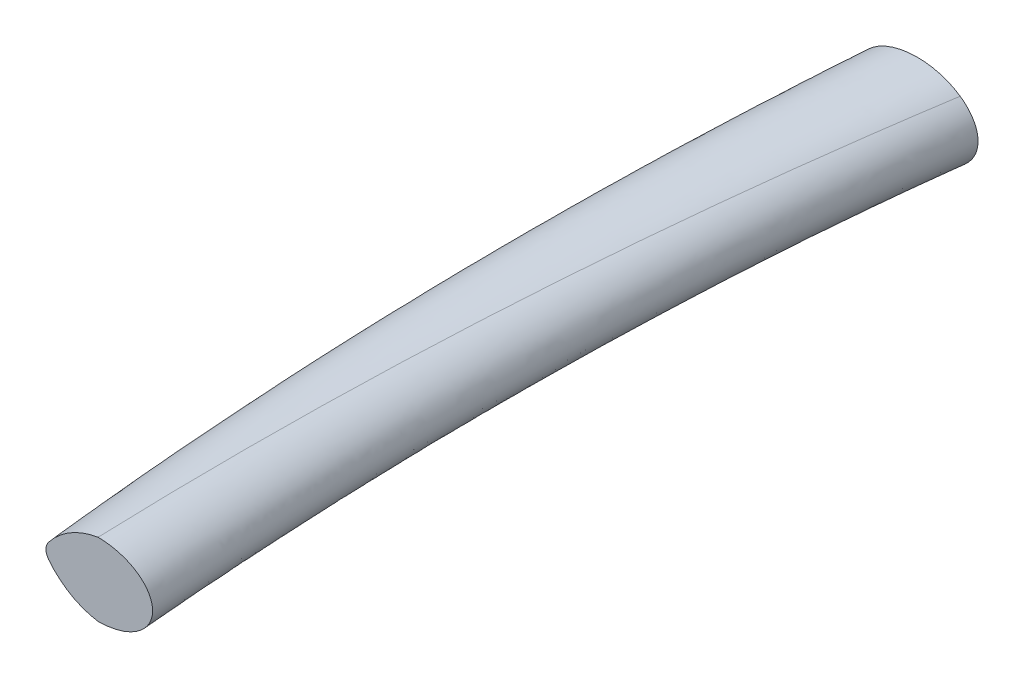
ISO-10303-21;
HEADER;
FILE_DESCRIPTION(('STEP AP214'),'2;1');
FILE_NAME('part.step','',(''),(''),'','','');
FILE_SCHEMA(('AUTOMOTIVE_DESIGN { 1 0 10303 214 1 1 1 1 }'));
ENDSEC;
DATA;
#1=APPLICATION_CONTEXT('core data for automotive mechanical design processes');
#2=APPLICATION_PROTOCOL_DEFINITION('international standard','automotive_design',2000,#1);
#3=PRODUCT_CONTEXT('',#1,'mechanical');
#4=PRODUCT('Part','Part','',(#3));
#5=PRODUCT_RELATED_PRODUCT_CATEGORY('part','',(#4));
#6=PRODUCT_DEFINITION_FORMATION('','',#4);
#7=PRODUCT_DEFINITION_CONTEXT('part definition',#1,'design');
#8=PRODUCT_DEFINITION('design','',#6,#7);
#9=PRODUCT_DEFINITION_SHAPE('','',#8);
#10=(LENGTH_UNIT() NAMED_UNIT(*) SI_UNIT(.MILLI.,.METRE.));
#11=(NAMED_UNIT(*) PLANE_ANGLE_UNIT() SI_UNIT($,.RADIAN.));
#12=(NAMED_UNIT(*) SI_UNIT($,.STERADIAN.) SOLID_ANGLE_UNIT());
#13=UNCERTAINTY_MEASURE_WITH_UNIT(LENGTH_MEASURE(1.E-05),#10,'distance_accuracy_value','');
#14=(GEOMETRIC_REPRESENTATION_CONTEXT(3) GLOBAL_UNCERTAINTY_ASSIGNED_CONTEXT((#13)) GLOBAL_UNIT_ASSIGNED_CONTEXT((#10,
#11,#12)) REPRESENTATION_CONTEXT('',''));
#15=CARTESIAN_POINT('',(0.,0.,0.));
#16=DIRECTION('',(0.,0.,1.));
#17=DIRECTION('',(1.,0.,0.));
#18=AXIS2_PLACEMENT_3D('',#15,#16,#17);
#19=CARTESIAN_POINT('',(0.,0.,-270.));
#20=DIRECTION('',(0.,0.,1.));
#21=DIRECTION('',(1.,0.,0.));
#22=AXIS2_PLACEMENT_3D('',#19,#20,#21);
#23=PLANE('',#22);
#24=CARTESIAN_POINT('',(0.,0.,-270.));
#25=DIRECTION('',(0.,0.,1.));
#26=DIRECTION('',(1.,0.,0.));
#27=AXIS2_PLACEMENT_3D('',#24,#25,#26);
#28=ELLIPSE('',#27,20.,14.);
#29=CARTESIAN_POINT('',(14.1114468725289,-9.92093054658983,-270.));
#30=VERTEX_POINT('',#29);
#31=CARTESIAN_POINT('',(14.1114468725289,9.92093054658982,-270.));
#32=VERTEX_POINT('',#31);
#33=EDGE_CURVE('E13',#30,#32,#28,.T.);
#34=ORIENTED_EDGE('',*,*,#33,.F.);
#35=EDGE_CURVE('E137',#32,#30,#28,.T.);
#36=ORIENTED_EDGE('',*,*,#35,.F.);
#37=EDGE_LOOP('',(#34,#36));
#38=FACE_BOUND('',#37,.T.);
#39=ADVANCED_FACE('F127',(#38),#23,.F.);
#40=CARTESIAN_POINT('',(0.,0.,0.));
#41=DIRECTION('',(0.,0.,1.));
#42=DIRECTION('',(1.,0.,0.));
#43=AXIS2_PLACEMENT_3D('',#40,#41,#42);
#44=PLANE('',#43);
#45=CARTESIAN_POINT('',(0.,0.,0.));
#46=DIRECTION('',(0.,0.,1.));
#47=DIRECTION('',(1.,0.,0.));
#48=AXIS2_PLACEMENT_3D('',#45,#46,#47);
#49=ELLIPSE('',#48,18.,12.);
#50=CARTESIAN_POINT('',(0.,-12.,0.));
#51=VERTEX_POINT('',#50);
#52=CARTESIAN_POINT('',(0.,12.,0.));
#53=VERTEX_POINT('',#52);
#54=EDGE_CURVE('E220',#51,#53,#49,.T.);
#55=ORIENTED_EDGE('',*,*,#54,.T.);
#56=CARTESIAN_POINT('',(3.94101136206633,-13.4115170430995,0.));
#57=DIRECTION('',(0.,0.,1.));
#58=DIRECTION('',(1.,0.,0.));
#59=AXIS2_PLACEMENT_3D('',#56,#57,#58);
#60=CIRCLE('',#59,25.7153022340332);
#61=CARTESIAN_POINT('',(-16.2837413816975,2.47042696389443,0.));
#62=VERTEX_POINT('',#61);
#63=EDGE_CURVE('E179',#53,#62,#60,.T.);
#64=ORIENTED_EDGE('',*,*,#63,.T.);
#65=CARTESIAN_POINT('',(-13.1377930960349,0.,0.));
#66=DIRECTION('',(0.,0.,1.));
#67=DIRECTION('',(1.,0.,0.));
#68=AXIS2_PLACEMENT_3D('',#65,#66,#67);
#69=CIRCLE('',#68,4.);
#70=CARTESIAN_POINT('',(-16.2837413815411,-2.47042696409362,0.));
#71=VERTEX_POINT('',#70);
#72=EDGE_CURVE('E166',#62,#71,#69,.T.);
#73=ORIENTED_EDGE('',*,*,#72,.T.);
#74=CARTESIAN_POINT('',(3.94101136206633,13.4115170430995,0.));
#75=DIRECTION('',(0.,0.,1.));
#76=DIRECTION('',(-1.,0.,0.));
#77=AXIS2_PLACEMENT_3D('',#74,#75,#76);
#78=CIRCLE('',#77,25.7153022340332);
#79=EDGE_CURVE('E162',#71,#51,#78,.T.);
#80=ORIENTED_EDGE('',*,*,#79,.T.);
#81=EDGE_LOOP('',(#55,#64,#73,#80));
#82=FACE_BOUND('',#81,.T.);
#83=ADVANCED_FACE('F178',(#82),#44,.T.);
#84=CARTESIAN_POINT('',(0.,-12.,0.));
#85=CARTESIAN_POINT('',(-3.7821357123623,-11.3069768488633,-89.7108183320864));
#86=CARTESIAN_POINT('',(0.917456530571978,-10.6139536977266,-180.109221722746));
#87=CARTESIAN_POINT('',(14.1114468725289,-9.92093054658983,-270.));
#88=CARTESIAN_POINT('',(-0.598921098197556,-11.9071147602493,0.));
#89=CARTESIAN_POINT('',(-4.33694156980424,-11.3534499845303,-89.7108183320864));
#90=CARTESIAN_POINT('',(0.406765913885656,-10.7997852088112,-180.109221722746));
#91=CARTESIAN_POINT('',(13.6448714965982,-10.2461204330922,-270.));
#92=CARTESIAN_POINT('',(-1.67670720468574,-11.6983902718868,0.));
#93=CARTESIAN_POINT('',(-5.38482952299914,-11.4225111753834,-89.7108183320864));
#94=CARTESIAN_POINT('',(-0.611223886015947,-11.1466320788799,-180.109221722746));
#95=CARTESIAN_POINT('',(12.6567798499899,-10.8707529823765,-270.));
#96=CARTESIAN_POINT('',(-3.5585943263567,-11.2165222330611,0.));
#97=CARTESIAN_POINT('',(-7.37190437563145,-11.4778495232536,-89.7108183320864));
#98=CARTESIAN_POINT('',(-2.70348646960963,-11.739176813446,-180.109221722746));
#99=CARTESIAN_POINT('',(10.4593295354348,-12.0005041036384,-270.));
#100=CARTESIAN_POINT('',(-5.57855783676103,-10.5174315551802,0.));
#101=CARTESIAN_POINT('',(-9.77338255343805,-11.3974942928601,-89.7108183320864));
#102=CARTESIAN_POINT('',(-5.4864793148185,-12.2775570305401,-180.109221722746));
#103=CARTESIAN_POINT('',(7.29482202282371,-13.15761976822,-270.));
#104=CARTESIAN_POINT('',(-7.70910758393084,-9.55082304836422,0.));
#105=CARTESIAN_POINT('',(-12.6844664622959,-11.0326936129368,-89.7108183320864));
#106=CARTESIAN_POINT('',(-9.17809738536431,-12.5145641775094,-180.109221722746));
#107=CARTESIAN_POINT('',(2.8226697905899,-13.996434742082,-270.));
#108=CARTESIAN_POINT('',(-9.64159159504831,-8.4602198552572,0.));
#109=CARTESIAN_POINT('',(-15.6688488812444,-10.3320530818283,-89.7108183320864));
#110=CARTESIAN_POINT('',(-13.2143782121439,-12.2038863083994,-180.109221722746));
#111=CARTESIAN_POINT('',(-2.26550944402073,-14.0757195349705,-270.));
#112=CARTESIAN_POINT('',(-11.4345863549398,-7.23857989750611,0.));
#113=CARTESIAN_POINT('',(-18.6855761026203,-9.2021629658591,-89.7108183320865));
#114=CARTESIAN_POINT('',(-17.4548378950043,-11.1657460342121,-180.109221722746));
#115=CARTESIAN_POINT('',(-7.72970158836559,-13.1293291025651,-270.));
#116=CARTESIAN_POINT('',(-12.8411713421898,-6.09684668951374,0.));
#117=CARTESIAN_POINT('',(-21.0938043459894,-7.83042990132994,-89.7108183320862));
#118=CARTESIAN_POINT('',(-20.8647093944925,-9.56401311314613,-180.109221722745));
#119=CARTESIAN_POINT('',(-12.1412163439729,-11.2975963249623,-269.999999999999));
#120=CARTESIAN_POINT('',(-13.9275941848375,-5.09279856732135,0.));
#121=CARTESIAN_POINT('',(-22.8353285146213,-6.46132364717604,-89.7108183320866));
#122=CARTESIAN_POINT('',(-23.2613348891084,-7.82984872703074,-180.109221722746));
#123=CARTESIAN_POINT('',(-15.1929431645729,-9.19837380688543,-270.000000000001));
#124=CARTESIAN_POINT('',(-14.7258452494914,-4.28752991052475,0.));
#125=CARTESIAN_POINT('',(-24.0163213031361,-5.30487420518244,-89.7108183320863));
#126=CARTESIAN_POINT('',(-24.8250694014841,-6.32221849984013,-180.109221722746));
#127=CARTESIAN_POINT('',(-17.1394194008095,-7.33956279449782,-270.));
#128=CARTESIAN_POINT('',(-15.5103867530576,-3.42312690132277,0.));
#129=CARTESIAN_POINT('',(-25.0416951314883,-4.02953076587487,-89.7108183320866));
#130=CARTESIAN_POINT('',(-26.0912755546224,-4.63593463042698,-180.109221722746));
#131=CARTESIAN_POINT('',(-18.6464578787338,-5.24233849497909,-270.000000000001));
#132=CARTESIAN_POINT('',(-16.0266785211364,-2.79778190180741,0.));
#133=CARTESIAN_POINT('',(-25.6050179124091,-3.11267471831597,-89.7108183320864));
#134=CARTESIAN_POINT('',(-26.7016293483853,-3.42756753482452,-180.109221722746));
#135=CARTESIAN_POINT('',(-19.3038426853388,-3.74246035133307,-270.));
#136=CARTESIAN_POINT('',(-16.3867965682548,-2.33919204289706,0.));
#137=CARTESIAN_POINT('',(-25.9552135001699,-2.45391826678631,-89.7108183320864));
#138=CARTESIAN_POINT('',(-27.0419024767884,-2.56864449067555,-180.109221722746));
#139=CARTESIAN_POINT('',(-19.6341933543843,-2.68337071456479,-270.));
#140=CARTESIAN_POINT('',(-16.5960522513289,-2.0394275612246,0.));
#141=CARTESIAN_POINT('',(-26.1402177440422,-2.07836047742523,-89.7108183320864));
#142=CARTESIAN_POINT('',(-27.202655281459,-2.11729339362585,-180.109221722746));
#143=CARTESIAN_POINT('',(-19.7706947198532,-2.15622630982648,-270.));
#144=CARTESIAN_POINT('',(-16.8928310421582,-1.44170278318442,0.));
#145=CARTESIAN_POINT('',(-26.3823488243434,-1.43929362097183,-89.7108183320864));
#146=CARTESIAN_POINT('',(-27.3901386512321,-1.43688445875924,-180.109221722746));
#147=CARTESIAN_POINT('',(-19.9035303790981,-1.43447529654664,-270.));
#148=CARTESIAN_POINT('',(-17.0998683660204,-0.706465945771255,0.));
#149=CARTESIAN_POINT('',(-26.5461243178638,-0.715615351835557,-89.7108183320864));
#150=CARTESIAN_POINT('',(-27.5106523144107,-0.724764757899857,-180.109221722746));
#151=CARTESIAN_POINT('',(-19.9807822119348,-0.733914163964156,-270.));
#152=CARTESIAN_POINT('',(-17.1377930960349,-0.221898691755006,0.));
#153=CARTESIAN_POINT('',(-26.5778134005619,-0.232191191333448,-89.7108183320864));
#154=CARTESIAN_POINT('',(-27.5361057497923,-0.242483690911888,-180.109221722746));
#155=CARTESIAN_POINT('',(-20.,-0.252776190490326,-270.));
#156=CARTESIAN_POINT('',(-17.1377930960349,0.221898691755007,0.));
#157=CARTESIAN_POINT('',(-26.5778134005619,0.232191191333446,-89.7108183320864));
#158=CARTESIAN_POINT('',(-27.5361057497923,0.242483690911886,-180.109221722746));
#159=CARTESIAN_POINT('',(-20.,0.252776190490329,-270.));
#160=CARTESIAN_POINT('',(-17.0998683669463,0.706465851376212,0.));
#161=CARTESIAN_POINT('',(-26.546128898442,0.715622498814572,-89.7108183320864));
#162=CARTESIAN_POINT('',(-27.5106614746411,0.724779146252933,-180.109221722746));
#163=CARTESIAN_POINT('',(-19.9807959518176,0.733935793691296,-270.));
#164=CARTESIAN_POINT('',(-16.8928311476379,1.44170248961394,0.));
#165=CARTESIAN_POINT('',(-26.3823286254904,1.43932522872863,-89.7108183320864));
#166=CARTESIAN_POINT('',(-27.3900981480463,1.43694796784332,-180.109221722746));
#167=CARTESIAN_POINT('',(-19.9034695715796,1.43457070695802,-270.));
#168=CARTESIAN_POINT('',(-16.5960523841801,2.03942735826623,0.));
#169=CARTESIAN_POINT('',(-26.1402289532585,2.07834066565461,-89.7108183320864));
#170=CARTESIAN_POINT('',(-27.2026775670403,2.11725397304299,-180.109221722746));
#171=CARTESIAN_POINT('',(-19.7707280817995,2.15616728043137,-270.));
#172=CARTESIAN_POINT('',(-16.3867966207668,2.33919197602603,0.));
#173=CARTESIAN_POINT('',(-25.9552135252558,2.45391825401535,-89.7108183320864));
#174=CARTESIAN_POINT('',(-27.0419024744483,2.56864453200468,-180.109221722746));
#175=CARTESIAN_POINT('',(-19.634193324618,2.683370809994,-270.));
#176=CARTESIAN_POINT('',(-16.0266785342644,2.79778188508966,0.));
#177=CARTESIAN_POINT('',(-25.6050179205696,3.11267470906732,-89.7108183320864));
#178=CARTESIAN_POINT('',(-26.7016293515781,3.42756753304499,-180.109221722746));
#179=CARTESIAN_POINT('',(-19.3038426835641,3.74246035702266,-270.));
#180=CARTESIAN_POINT('',(-15.5103867817002,3.42312686742877,0.));
#181=CARTESIAN_POINT('',(-25.0416951459687,4.02953075268513,-89.7108183320864));
#182=CARTESIAN_POINT('',(-26.0912755549407,4.6359346379415,-180.109221722746));
#183=CARTESIAN_POINT('',(-18.64645786489,5.24233852319787,-270.));
#184=CARTESIAN_POINT('',(-14.7258452761455,4.28752988309202,0.));
#185=CARTESIAN_POINT('',(-24.0163213123622,5.30487419627291,-89.7108183320865));
#186=CARTESIAN_POINT('',(-24.8250693932823,6.3222185094538,-180.109221722746));
#187=CARTESIAN_POINT('',(-17.1394193751798,7.33956282263469,-270.));
#188=CARTESIAN_POINT('',(-13.9275941912066,5.09279856202337,0.));
#189=CARTESIAN_POINT('',(-22.8353285098692,6.46132365084612,-89.7108183320864));
#190=CARTESIAN_POINT('',(-23.2613348732351,7.82984873966887,-180.109221722746));
#191=CARTESIAN_POINT('',(-15.1929431375784,9.19837382849163,-270.));
#192=CARTESIAN_POINT('',(-12.8411713012869,6.09684672704417,0.));
#193=CARTESIAN_POINT('',(-21.0938043163074,7.83042992618065,-89.7108183320863));
#194=CARTESIAN_POINT('',(-20.8647093760312,9.56401312531714,-180.109221722746));
#195=CARTESIAN_POINT('',(-12.1412163367324,11.2975963244536,-270.));
#196=CARTESIAN_POINT('',(-11.4345862248433,7.23857999932121,0.));
#197=CARTESIAN_POINT('',(-18.6855760350622,9.20216302624225,-89.7108183320865));
#198=CARTESIAN_POINT('',(-17.4548378899845,11.1657460531633,-180.109221722746));
#199=CARTESIAN_POINT('',(-7.72970164588418,13.1293290800843,-270.));
#200=CARTESIAN_POINT('',(-9.64159133142973,8.46022002421739,0.));
#201=CARTESIAN_POINT('',(-15.668848749991,10.332053189789,-89.7108183320863));
#202=CARTESIAN_POINT('',(-13.2143782132557,12.2038863553606,-180.109221722746));
#203=CARTESIAN_POINT('',(-2.26550957749774,14.0757195209323,-270.));
#204=CARTESIAN_POINT('',(-7.70910717728228,9.55082325861147,0.));
#205=CARTESIAN_POINT('',(-12.6844662438883,11.0326937585485,-89.7108183320865));
#206=CARTESIAN_POINT('',(-9.17809735519781,12.5145642584856,-180.109221722746));
#207=CARTESIAN_POINT('',(2.82266963251537,13.9964347584226,-270.));
#208=CARTESIAN_POINT('',(-5.57855731554213,10.5174317657642,0.));
#209=CARTESIAN_POINT('',(-9.7733822479179,11.3974944450926,-89.7108183320863));
#210=CARTESIAN_POINT('',(-5.48647922499708,12.2775571244209,-180.109221722746));
#211=CARTESIAN_POINT('',(7.29482189694639,13.1576198037493,-270.));
#212=CARTESIAN_POINT('',(-3.55859378200699,11.2165223955493,0.));
#213=CARTESIAN_POINT('',(-7.37190403951109,11.4778496440507,-89.7108183320864));
#214=CARTESIAN_POINT('',(-2.7034863417186,11.7391768925521,-180.109221722746));
#215=CARTESIAN_POINT('',(10.4593294550965,12.0005041410535,-270.));
#216=CARTESIAN_POINT('',(-1.67670681318751,11.6983903558391,0.));
#217=CARTESIAN_POINT('',(-5.38482927190501,11.4225112372671,-89.7108183320864));
#218=CARTESIAN_POINT('',(-0.611223775325924,11.146632118695,-180.109221722746));
#219=CARTESIAN_POINT('',(12.6567798202758,10.870753000123,-270.));
#220=CARTESIAN_POINT('',(-0.598920908404499,11.9071147896838,0.));
#221=CARTESIAN_POINT('',(-4.33694144592141,11.3534500059974,-89.7108183320864));
#222=CARTESIAN_POINT('',(0.406765971858253,10.7997852223109,-180.109221722746));
#223=CARTESIAN_POINT('',(13.6448714886606,10.2461204386245,-270.));
#224=CARTESIAN_POINT('',(0.,12.,0.));
#225=CARTESIAN_POINT('',(-3.7821357123623,11.3069768488633,-89.7108183320864));
#226=CARTESIAN_POINT('',(0.917456530571983,10.6139536977265,-180.109221722746));
#227=CARTESIAN_POINT('',(14.1114468725289,9.92093054658982,-270.));
#228=B_SPLINE_SURFACE_WITH_KNOTS('',3,3,((#84,#85,#86,#87),(#88,#89,#90,#91),(#92,#93,#94,#95),
(#96,#97,#98,#99),(#100,#101,#102,#103),(#104,#105,#106,#107),(#108,#109,#110,#111),(#112,#113,
#114,#115),(#116,#117,#118,#119),(#120,#121,#122,#123),(#124,#125,#126,#127),(#128,#129,#130,
#131),(#132,#133,#134,#135),(#136,#137,#138,#139),(#140,#141,#142,#143),(#144,#145,#146,#147),
(#148,#149,#150,#151),(#152,#153,#154,#155),(#156,#157,#158,#159),(#160,#161,#162,#163),(#164,
#165,#166,#167),(#168,#169,#170,#171),(#172,#173,#174,#175),(#176,#177,#178,#179),(#180,#181,
#182,#183),(#184,#185,#186,#187),(#188,#189,#190,#191),(#192,#193,#194,#195),(#196,#197,#198,
#199),(#200,#201,#202,#203),(#204,#205,#206,#207),(#208,#209,#210,#211),(#212,#213,#214,#215),
(#216,#217,#218,#219),(#220,#221,#222,#223),(#224,#225,#226,#227)),.UNSPECIFIED.,.F.,.F.,.F.,(4,
1,1,1,1,1,1,1,1,1,1,2,1,1,1,2,1,1,1,2,1,1,1,1,1,1,1,1,1,1,4),(4,4),(0.371412947621191,
0.38926690768464,0.407120867748089,0.442828787874987,0.478536708001886,0.514244628128784,
0.549952548255683,0.585660468382581,0.60351442844603,0.621368388509479,0.639222348572929,
0.657076308636378,0.664233869948542,0.671391431260707,0.678548992572871,0.685706553885036,
0.6928641151972,0.700021676509365,0.707179237821529,0.714336799133694,0.732190749187838,
0.750044699241982,0.767898649296126,0.78575259935027,0.821460499458559,0.857168399566847,
0.892876299675135,0.928584199783423,0.964292099891712,0.982146049945856,1.),(0.,1.),.UNSPECIFIED.);
#229=CARTESIAN_POINT('',(0.,12.,0.));
#230=CARTESIAN_POINT('',(-3.7821357123623,11.3069768488633,-89.7108183320864));
#231=CARTESIAN_POINT('',(0.917456530571983,10.6139536977265,-180.109221722746));
#232=CARTESIAN_POINT('',(14.1114468725289,9.92093054658982,-270.));
#233=B_SPLINE_CURVE_WITH_KNOTS('',3,(#229,#230,#231,#232),.UNSPECIFIED.,.F.,.F.,(4,4),(0.,1.),.UNSPECIFIED.);
#234=EDGE_CURVE('E145',#53,#32,#233,.T.);
#235=CARTESIAN_POINT('',(0.,-12.,0.));
#236=CARTESIAN_POINT('',(-3.7821357123623,-11.3069768488633,-89.7108183320864));
#237=CARTESIAN_POINT('',(0.917456530571978,-10.6139536977266,-180.109221722746));
#238=CARTESIAN_POINT('',(14.1114468725289,-9.92093054658983,-270.));
#239=B_SPLINE_CURVE_WITH_KNOTS('',3,(#235,#236,#237,#238),.UNSPECIFIED.,.F.,.F.,(4,4),(0.,1.),.UNSPECIFIED.);
#240=EDGE_CURVE('E170',#51,#30,#239,.T.);
#241=ORIENTED_EDGE('',*,*,#79,.F.);
#242=ORIENTED_EDGE('',*,*,#72,.F.);
#243=ORIENTED_EDGE('',*,*,#63,.F.);
#244=ORIENTED_EDGE('',*,*,#234,.T.);
#245=ORIENTED_EDGE('',*,*,#35,.T.);
#246=ORIENTED_EDGE('',*,*,#240,.F.);
#247=EDGE_LOOP('',(#241,#242,#243,#244,#245,#246));
#248=FACE_BOUND('',#247,.T.);
#249=ADVANCED_FACE('F165',(#248),#228,.T.);
#250=CARTESIAN_POINT('',(0.,12.,0.));
#251=CARTESIAN_POINT('',(-3.7821357123623,11.3069768488633,-89.7108183320864));
#252=CARTESIAN_POINT('',(0.917456530571983,10.6139536977265,-180.109221722746));
#253=CARTESIAN_POINT('',(14.1114468725289,9.92093054658982,-270.));
#254=CARTESIAN_POINT('',(0.991589949121724,12.,0.));
#255=CARTESIAN_POINT('',(-2.98432997895369,11.2116689032431,-89.7108183320864));
#256=CARTESIAN_POINT('',(1.52147804826748,10.4233378064863,-180.109221722746));
#257=CARTESIAN_POINT('',(14.5216841745113,9.63500670972943,-270.));
#258=CARTESIAN_POINT('',(2.97479737328301,11.8910347814716,0.));
#259=CARTESIAN_POINT('',(-1.39636083000099,10.9372427689456,-89.7108183320865));
#260=CARTESIAN_POINT('',(2.71420892201158,9.98345075641962,-180.109221722746));
#261=CARTESIAN_POINT('',(15.3191767730468,9.02965874389363,-270.));
#262=CARTESIAN_POINT('',(5.91292514251895,11.39529958377,0.));
#263=CARTESIAN_POINT('',(0.93236045062915,10.2697816228577,-89.7108183320866));
#264=CARTESIAN_POINT('',(4.43352371403593,9.14426366194542,-180.109221722746));
#265=CARTESIAN_POINT('',(16.4290850764654,8.01874570103311,-270.000000000001));
#266=CARTESIAN_POINT('',(8.77142701699348,10.5504308798018,0.));
#267=CARTESIAN_POINT('',(3.1734260772578,9.33447103530248,-89.7108183320864));
#268=CARTESIAN_POINT('',(6.05715309281871,8.11851119080321,-180.109221722746));
#269=CARTESIAN_POINT('',(17.4352782074023,6.90255134630394,-270.));
#270=CARTESIAN_POINT('',(11.4914943704669,9.32707186435209,0.));
#271=CARTESIAN_POINT('',(5.27947983506057,8.11275719018409,-89.7108183320862));
#272=CARTESIAN_POINT('',(7.54919325495079,6.8984425160161,-180.109221722745));
#273=CARTESIAN_POINT('',(18.3133047738636,5.68412784184811,-269.999999999999));
#274=CARTESIAN_POINT('',(13.9850352345254,7.68352473301663,0.));
#275=CARTESIAN_POINT('',(7.18364328109686,6.57785893861362,-89.7108183320864));
#276=CARTESIAN_POINT('',(8.86397928296492,5.47219314421061,-180.109221722746));
#277=CARTESIAN_POINT('',(19.0387133838556,4.3665273498076,-270.));
#278=CARTESIAN_POINT('',(16.1066301731188,5.57165288040996,0.));
#279=CARTESIAN_POINT('',(8.779851757877,4.70317469191868,-89.7108183320866));
#280=CARTESIAN_POINT('',(9.93480129793176,3.8346965034274,-180.109221722746));
#281=CARTESIAN_POINT('',(19.5841489370092,2.96621831493612,-270.000000000001));
#282=CARTESIAN_POINT('',(17.6200871347444,2.9723734647305,0.));
#283=CARTESIAN_POINT('',(9.90152553094272,2.48147203714945,-89.7108183320865));
#284=CARTESIAN_POINT('',(10.6646918824376,1.99057060956841,-180.109221722746));
#285=CARTESIAN_POINT('',(19.9222563329552,1.49966918198737,-270.));
#286=CARTESIAN_POINT('',(18.1911755438894,0.,0.));
#287=CARTESIAN_POINT('',(10.3213250232631,0.,-89.7108183320863));
#288=CARTESIAN_POINT('',(10.9332024579334,0.,-180.109221722746));
#289=CARTESIAN_POINT('',(20.0394779916264,0.,-270.));
#290=CARTESIAN_POINT('',(17.6200871347443,-2.97237346473046,0.));
#291=CARTESIAN_POINT('',(9.90152553094267,-2.48147203714944,-89.7108183320863));
#292=CARTESIAN_POINT('',(10.6646918824376,-1.99057060956842,-180.109221722746));
#293=CARTESIAN_POINT('',(19.9222563329552,-1.49966918198739,-270.));
#294=CARTESIAN_POINT('',(16.1066301731189,-5.57165288040996,0.));
#295=CARTESIAN_POINT('',(8.77985175787702,-4.70317469191869,-89.7108183320864));
#296=CARTESIAN_POINT('',(9.93480129793175,-3.83469650342742,-180.109221722746));
#297=CARTESIAN_POINT('',(19.5841489370091,-2.96621831493614,-270.));
#298=CARTESIAN_POINT('',(13.9850352345253,-7.68352473301661,0.));
#299=CARTESIAN_POINT('',(7.18364328109683,-6.57785893861361,-89.7108183320865));
#300=CARTESIAN_POINT('',(8.8639792829649,-5.47219314421062,-180.109221722746));
#301=CARTESIAN_POINT('',(19.0387133838556,-4.36652734980762,-270.));
#302=CARTESIAN_POINT('',(11.491494370467,-9.32707186435209,0.));
#303=CARTESIAN_POINT('',(5.2794798350606,-8.11275719018411,-89.7108183320865));
#304=CARTESIAN_POINT('',(7.5491932549508,-6.89844251601611,-180.109221722746));
#305=CARTESIAN_POINT('',(18.3133047738637,-5.68412784184812,-270.));
#306=CARTESIAN_POINT('',(8.77142701699347,-10.5504308798017,0.));
#307=CARTESIAN_POINT('',(3.17342607725779,-9.33447103530248,-89.7108183320864));
#308=CARTESIAN_POINT('',(6.0571530928187,-8.11851119080321,-180.109221722746));
#309=CARTESIAN_POINT('',(17.4352782074023,-6.90255134630395,-270.));
#310=CARTESIAN_POINT('',(5.91292514251894,-11.39529958377,0.));
#311=CARTESIAN_POINT('',(0.932360450629133,-10.2697816228577,-89.7108183320863));
#312=CARTESIAN_POINT('',(4.43352371403591,-9.14426366194543,-180.109221722746));
#313=CARTESIAN_POINT('',(16.4290850764653,-8.01874570103312,-270.));
#314=CARTESIAN_POINT('',(2.97479737328302,-11.8910347814716,0.));
#315=CARTESIAN_POINT('',(-1.396360830001,-10.9372427689456,-89.7108183320864));
#316=CARTESIAN_POINT('',(2.71420892201157,-9.98345075641962,-180.109221722746));
#317=CARTESIAN_POINT('',(15.3191767730468,-9.02965874389364,-270.));
#318=CARTESIAN_POINT('',(0.991589949121722,-12.,0.));
#319=CARTESIAN_POINT('',(-2.98432997895369,-11.2116689032431,-89.7108183320864));
#320=CARTESIAN_POINT('',(1.52147804826748,-10.4233378064863,-180.109221722746));
#321=CARTESIAN_POINT('',(14.5216841745113,-9.63500670972943,-270.));
#322=CARTESIAN_POINT('',(0.,-12.,0.));
#323=CARTESIAN_POINT('',(-3.7821357123623,-11.3069768488633,-89.7108183320864));
#324=CARTESIAN_POINT('',(0.917456530571978,-10.6139536977266,-180.109221722746));
#325=CARTESIAN_POINT('',(14.1114468725289,-9.92093054658983,-270.));
#326=B_SPLINE_SURFACE_WITH_KNOTS('',3,3,((#250,#251,#252,#253),(#254,#255,#256,#257),(#258,#259,
#260,#261),(#262,#263,#264,#265),(#266,#267,#268,#269),(#270,#271,#272,#273),(#274,#275,#276,
#277),(#278,#279,#280,#281),(#282,#283,#284,#285),(#286,#287,#288,#289),(#290,#291,#292,#293),
(#294,#295,#296,#297),(#298,#299,#300,#301),(#302,#303,#304,#305),(#306,#307,#308,#309),(#310,
#311,#312,#313),(#314,#315,#316,#317),(#318,#319,#320,#321),(#322,#323,#324,#325)),
.UNSPECIFIED.,.F.,.F.,.F.,(4,1,1,1,1,1,1,1,1,1,1,1,1,1,1,1,4),(4,4),(0.,0.0232133092263244,
0.0464266184526488,0.0696399276789732,0.0928532369052976,0.116066546131622,0.139279855357946,
0.162493164584271,0.185706473810595,0.20891978303692,0.232133092263244,0.255346401489569,
0.278559710715893,0.301773019942217,0.324986329168542,0.348199638394866,0.371412947621191),(0.,
1.),.UNSPECIFIED.);
#327=ORIENTED_EDGE('',*,*,#54,.F.);
#328=ORIENTED_EDGE('',*,*,#240,.T.);
#329=ORIENTED_EDGE('',*,*,#33,.T.);
#330=ORIENTED_EDGE('',*,*,#234,.F.);
#331=EDGE_LOOP('',(#327,#328,#329,#330));
#332=FACE_BOUND('',#331,.T.);
#333=ADVANCED_FACE('F198',(#332),#326,.T.);
#334=CLOSED_SHELL('',(#39,#83,#249,#333));
#335=MANIFOLD_SOLID_BREP('B2',#334);
#336=ADVANCED_BREP_SHAPE_REPRESENTATION('',(#18,#335),#14);
#337=SHAPE_DEFINITION_REPRESENTATION(#9,#336);
ENDSEC;
END-ISO-10303-21;
